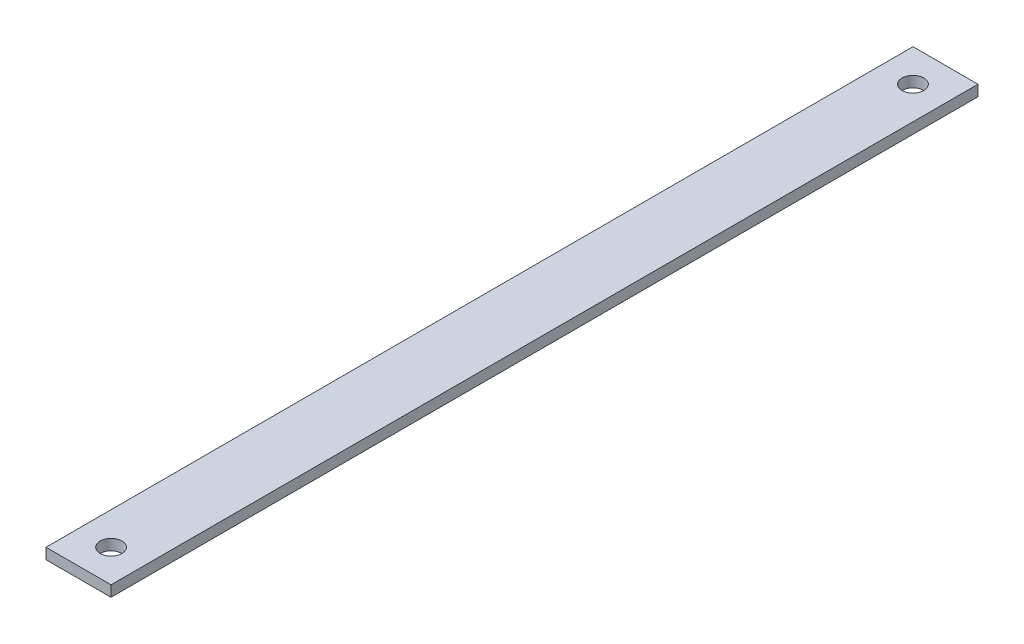
ISO-10303-21;
HEADER;
FILE_DESCRIPTION(('STEP AP214'),'2;1');
FILE_NAME('part.step','',(''),(''),'','','');
FILE_SCHEMA(('AUTOMOTIVE_DESIGN { 1 0 10303 214 1 1 1 1 }'));
ENDSEC;
DATA;
#1=APPLICATION_CONTEXT('core data for automotive mechanical design processes');
#2=APPLICATION_PROTOCOL_DEFINITION('international standard','automotive_design',2000,#1);
#3=PRODUCT_CONTEXT('',#1,'mechanical');
#4=PRODUCT('Part','Part','',(#3));
#5=PRODUCT_RELATED_PRODUCT_CATEGORY('part','',(#4));
#6=PRODUCT_DEFINITION_FORMATION('','',#4);
#7=PRODUCT_DEFINITION_CONTEXT('part definition',#1,'design');
#8=PRODUCT_DEFINITION('design','',#6,#7);
#9=PRODUCT_DEFINITION_SHAPE('','',#8);
#10=(LENGTH_UNIT() NAMED_UNIT(*) SI_UNIT(.MILLI.,.METRE.));
#11=(NAMED_UNIT(*) PLANE_ANGLE_UNIT() SI_UNIT($,.RADIAN.));
#12=(NAMED_UNIT(*) SI_UNIT($,.STERADIAN.) SOLID_ANGLE_UNIT());
#13=UNCERTAINTY_MEASURE_WITH_UNIT(LENGTH_MEASURE(1.E-05),#10,'distance_accuracy_value','');
#14=(GEOMETRIC_REPRESENTATION_CONTEXT(3) GLOBAL_UNCERTAINTY_ASSIGNED_CONTEXT((#13)) GLOBAL_UNIT_ASSIGNED_CONTEXT((#10,
#11,#12)) REPRESENTATION_CONTEXT('',''));
#15=CARTESIAN_POINT('',(0.,0.,0.));
#16=DIRECTION('',(0.,0.,1.));
#17=DIRECTION('',(1.,0.,0.));
#18=AXIS2_PLACEMENT_3D('',#15,#16,#17);
#19=CARTESIAN_POINT('',(0.,3.175,0.));
#20=DIRECTION('',(0.,-1.,0.));
#21=DIRECTION('',(0.,0.,-1.));
#22=AXIS2_PLACEMENT_3D('',#19,#20,#21);
#23=PLANE('',#22);
#24=DIRECTION('',(0.,0.,-1.));
#25=VECTOR('',#24,1.);
#26=CARTESIAN_POINT('',(9.525,3.175,127.));
#27=LINE('',#26,#25);
#28=CARTESIAN_POINT('',(9.525,3.175,127.));
#29=VERTEX_POINT('',#28);
#30=CARTESIAN_POINT('',(9.525,3.175,-127.));
#31=VERTEX_POINT('',#30);
#32=EDGE_CURVE('E85',#29,#31,#27,.T.);
#33=ORIENTED_EDGE('',*,*,#32,.T.);
#34=DIRECTION('',(-1.,0.,0.));
#35=VECTOR('',#34,1.);
#36=CARTESIAN_POINT('',(-9.525,3.175,-127.));
#37=LINE('',#36,#35);
#38=CARTESIAN_POINT('',(-9.525,3.175,-127.));
#39=VERTEX_POINT('',#38);
#40=EDGE_CURVE('E80',#31,#39,#37,.T.);
#41=ORIENTED_EDGE('',*,*,#40,.T.);
#42=DIRECTION('',(0.,0.,1.));
#43=VECTOR('',#42,1.);
#44=CARTESIAN_POINT('',(-9.525,3.175,127.));
#45=LINE('',#44,#43);
#46=CARTESIAN_POINT('',(-9.525,3.175,127.));
#47=VERTEX_POINT('',#46);
#48=EDGE_CURVE('E83',#39,#47,#45,.T.);
#49=ORIENTED_EDGE('',*,*,#48,.T.);
#50=DIRECTION('',(1.,0.,0.));
#51=VECTOR('',#50,1.);
#52=CARTESIAN_POINT('',(-9.525,3.175,127.));
#53=LINE('',#52,#51);
#54=EDGE_CURVE('E50',#47,#29,#53,.T.);
#55=ORIENTED_EDGE('',*,*,#54,.T.);
#56=EDGE_LOOP('',(#33,#41,#49,#55));
#57=FACE_BOUND('',#56,.T.);
#58=CARTESIAN_POINT('',(0.,3.175,-117.475));
#59=DIRECTION('',(0.,1.,0.));
#60=DIRECTION('',(0.,0.,1.));
#61=AXIS2_PLACEMENT_3D('',#58,#59,#60);
#62=CIRCLE('',#61,3.1877);
#63=CARTESIAN_POINT('',(0.,3.175,-114.2873));
#64=VERTEX_POINT('',#63);
#65=EDGE_CURVE('E100',#64,#64,#62,.T.);
#66=ORIENTED_EDGE('',*,*,#65,.F.);
#67=EDGE_LOOP('',(#66));
#68=FACE_BOUND('',#67,.T.);
#69=CARTESIAN_POINT('',(0.,3.175,117.475));
#70=DIRECTION('',(0.,1.,0.));
#71=DIRECTION('',(0.,0.,1.));
#72=AXIS2_PLACEMENT_3D('',#69,#70,#71);
#73=CIRCLE('',#72,3.1877);
#74=CARTESIAN_POINT('',(0.,3.175,120.6627));
#75=VERTEX_POINT('',#74);
#76=EDGE_CURVE('E115',#75,#75,#73,.T.);
#77=ORIENTED_EDGE('',*,*,#76,.F.);
#78=EDGE_LOOP('',(#77));
#79=FACE_BOUND('',#78,.T.);
#80=ADVANCED_FACE('F33',(#57,#68,#79),#23,.F.);
#81=CARTESIAN_POINT('',(0.,0.,0.));
#82=DIRECTION('',(0.,-1.,0.));
#83=DIRECTION('',(0.,0.,-1.));
#84=AXIS2_PLACEMENT_3D('',#81,#82,#83);
#85=PLANE('',#84);
#86=CARTESIAN_POINT('',(0.,0.,-117.475));
#87=DIRECTION('',(0.,1.,0.));
#88=DIRECTION('',(0.,0.,1.));
#89=AXIS2_PLACEMENT_3D('',#86,#87,#88);
#90=CIRCLE('',#89,3.1877);
#91=CARTESIAN_POINT('',(0.,0.,-114.2873));
#92=VERTEX_POINT('',#91);
#93=EDGE_CURVE('E112',#92,#92,#90,.T.);
#94=ORIENTED_EDGE('',*,*,#93,.T.);
#95=EDGE_LOOP('',(#94));
#96=FACE_BOUND('',#95,.T.);
#97=DIRECTION('',(0.,0.,-1.));
#98=VECTOR('',#97,1.);
#99=CARTESIAN_POINT('',(9.525,0.,127.));
#100=LINE('',#99,#98);
#101=CARTESIAN_POINT('',(9.525,0.,127.));
#102=VERTEX_POINT('',#101);
#103=CARTESIAN_POINT('',(9.525,0.,-127.));
#104=VERTEX_POINT('',#103);
#105=EDGE_CURVE('E97',#102,#104,#100,.T.);
#106=ORIENTED_EDGE('',*,*,#105,.F.);
#107=DIRECTION('',(1.,0.,0.));
#108=VECTOR('',#107,1.);
#109=CARTESIAN_POINT('',(-9.525,0.,127.));
#110=LINE('',#109,#108);
#111=CARTESIAN_POINT('',(-9.525,0.,127.));
#112=VERTEX_POINT('',#111);
#113=EDGE_CURVE('E73',#112,#102,#110,.T.);
#114=ORIENTED_EDGE('',*,*,#113,.F.);
#115=DIRECTION('',(0.,0.,1.));
#116=VECTOR('',#115,1.);
#117=CARTESIAN_POINT('',(-9.525,0.,127.));
#118=LINE('',#117,#116);
#119=CARTESIAN_POINT('',(-9.525,0.,-127.));
#120=VERTEX_POINT('',#119);
#121=EDGE_CURVE('E67',#120,#112,#118,.T.);
#122=ORIENTED_EDGE('',*,*,#121,.F.);
#123=DIRECTION('',(-1.,0.,0.));
#124=VECTOR('',#123,1.);
#125=CARTESIAN_POINT('',(-9.525,0.,-127.));
#126=LINE('',#125,#124);
#127=EDGE_CURVE('E89',#104,#120,#126,.T.);
#128=ORIENTED_EDGE('',*,*,#127,.F.);
#129=EDGE_LOOP('',(#106,#114,#122,#128));
#130=FACE_BOUND('',#129,.T.);
#131=CARTESIAN_POINT('',(0.,0.,117.475));
#132=DIRECTION('',(0.,1.,0.));
#133=DIRECTION('',(0.,0.,1.));
#134=AXIS2_PLACEMENT_3D('',#131,#132,#133);
#135=CIRCLE('',#134,3.1877);
#136=CARTESIAN_POINT('',(0.,0.,120.6627));
#137=VERTEX_POINT('',#136);
#138=EDGE_CURVE('E118',#137,#137,#135,.T.);
#139=ORIENTED_EDGE('',*,*,#138,.T.);
#140=EDGE_LOOP('',(#139));
#141=FACE_BOUND('',#140,.T.);
#142=ADVANCED_FACE('F108',(#96,#130,#141),#85,.T.);
#143=CARTESIAN_POINT('',(9.525,3.175,127.));
#144=DIRECTION('',(-1.,0.,0.));
#145=DIRECTION('',(0.,0.,1.));
#146=AXIS2_PLACEMENT_3D('',#143,#144,#145);
#147=PLANE('',#146);
#148=ORIENTED_EDGE('',*,*,#105,.T.);
#149=DIRECTION('',(0.,-1.,0.));
#150=VECTOR('',#149,1.);
#151=CARTESIAN_POINT('',(9.525,3.175,-127.));
#152=LINE('',#151,#150);
#153=EDGE_CURVE('E11',#31,#104,#152,.T.);
#154=ORIENTED_EDGE('',*,*,#153,.F.);
#155=ORIENTED_EDGE('',*,*,#32,.F.);
#156=DIRECTION('',(0.,-1.,0.));
#157=VECTOR('',#156,1.);
#158=CARTESIAN_POINT('',(9.525,3.175,127.));
#159=LINE('',#158,#157);
#160=EDGE_CURVE('E93',#29,#102,#159,.T.);
#161=ORIENTED_EDGE('',*,*,#160,.T.);
#162=EDGE_LOOP('',(#148,#154,#155,#161));
#163=FACE_BOUND('',#162,.T.);
#164=ADVANCED_FACE('F35',(#163),#147,.F.);
#165=CARTESIAN_POINT('',(-9.525,3.175,-127.));
#166=DIRECTION('',(0.,0.,1.));
#167=DIRECTION('',(1.,0.,0.));
#168=AXIS2_PLACEMENT_3D('',#165,#166,#167);
#169=PLANE('',#168);
#170=ORIENTED_EDGE('',*,*,#127,.T.);
#171=DIRECTION('',(0.,-1.,0.));
#172=VECTOR('',#171,1.);
#173=CARTESIAN_POINT('',(-9.525,3.175,-127.));
#174=LINE('',#173,#172);
#175=EDGE_CURVE('E42',#39,#120,#174,.T.);
#176=ORIENTED_EDGE('',*,*,#175,.F.);
#177=ORIENTED_EDGE('',*,*,#40,.F.);
#178=ORIENTED_EDGE('',*,*,#153,.T.);
#179=EDGE_LOOP('',(#170,#176,#177,#178));
#180=FACE_BOUND('',#179,.T.);
#181=ADVANCED_FACE('F88',(#180),#169,.F.);
#182=CARTESIAN_POINT('',(-9.525,3.175,127.));
#183=DIRECTION('',(1.,0.,0.));
#184=DIRECTION('',(0.,0.,-1.));
#185=AXIS2_PLACEMENT_3D('',#182,#183,#184);
#186=PLANE('',#185);
#187=ORIENTED_EDGE('',*,*,#121,.T.);
#188=DIRECTION('',(0.,-1.,0.));
#189=VECTOR('',#188,1.);
#190=CARTESIAN_POINT('',(-9.525,3.175,127.));
#191=LINE('',#190,#189);
#192=EDGE_CURVE('E90',#47,#112,#191,.T.);
#193=ORIENTED_EDGE('',*,*,#192,.F.);
#194=ORIENTED_EDGE('',*,*,#48,.F.);
#195=ORIENTED_EDGE('',*,*,#175,.T.);
#196=EDGE_LOOP('',(#187,#193,#194,#195));
#197=FACE_BOUND('',#196,.T.);
#198=ADVANCED_FACE('F91',(#197),#186,.F.);
#199=CARTESIAN_POINT('',(-9.525,3.175,127.));
#200=DIRECTION('',(0.,0.,-1.));
#201=DIRECTION('',(-1.,0.,0.));
#202=AXIS2_PLACEMENT_3D('',#199,#200,#201);
#203=PLANE('',#202);
#204=ORIENTED_EDGE('',*,*,#113,.T.);
#205=ORIENTED_EDGE('',*,*,#160,.F.);
#206=ORIENTED_EDGE('',*,*,#54,.F.);
#207=ORIENTED_EDGE('',*,*,#192,.T.);
#208=EDGE_LOOP('',(#204,#205,#206,#207));
#209=FACE_BOUND('',#208,.T.);
#210=ADVANCED_FACE('F105',(#209),#203,.F.);
#211=CARTESIAN_POINT('',(0.,3.175,-117.475));
#212=DIRECTION('',(0.,-1.,0.));
#213=DIRECTION('',(0.,0.,-1.));
#214=AXIS2_PLACEMENT_3D('',#211,#212,#213);
#215=CYLINDRICAL_SURFACE('',#214,3.1877);
#216=ORIENTED_EDGE('',*,*,#65,.T.);
#217=EDGE_LOOP('',(#216));
#218=FACE_BOUND('',#217,.T.);
#219=ORIENTED_EDGE('',*,*,#93,.F.);
#220=EDGE_LOOP('',(#219));
#221=FACE_BOUND('',#220,.T.);
#222=ADVANCED_FACE('F135',(#218,#221),#215,.F.);
#223=CARTESIAN_POINT('',(0.,3.175,117.475));
#224=DIRECTION('',(0.,-1.,0.));
#225=DIRECTION('',(0.,0.,-1.));
#226=AXIS2_PLACEMENT_3D('',#223,#224,#225);
#227=CYLINDRICAL_SURFACE('',#226,3.1877);
#228=ORIENTED_EDGE('',*,*,#76,.T.);
#229=EDGE_LOOP('',(#228));
#230=FACE_BOUND('',#229,.T.);
#231=ORIENTED_EDGE('',*,*,#138,.F.);
#232=EDGE_LOOP('',(#231));
#233=FACE_BOUND('',#232,.T.);
#234=ADVANCED_FACE('F124',(#230,#233),#227,.F.);
#235=CLOSED_SHELL('',(#80,#142,#164,#181,#198,#210,#222,#234));
#236=MANIFOLD_SOLID_BREP('B2',#235);
#237=ADVANCED_BREP_SHAPE_REPRESENTATION('',(#18,#236),#14);
#238=SHAPE_DEFINITION_REPRESENTATION(#9,#237);
ENDSEC;
END-ISO-10303-21;
